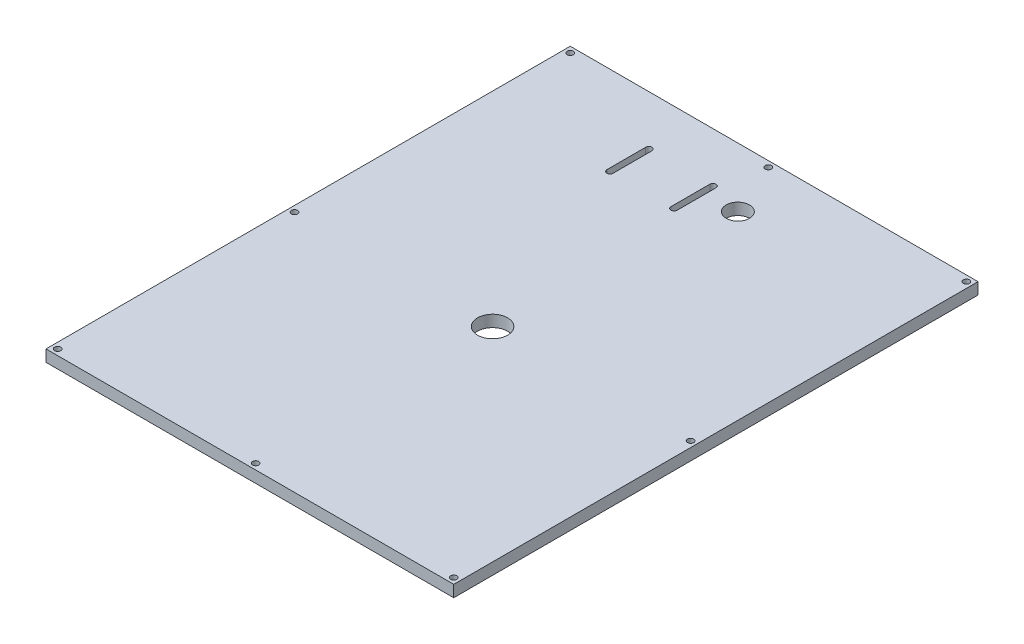
ISO-10303-21;
HEADER;
FILE_DESCRIPTION(('STEP AP214'),'2;1');
FILE_NAME('part.step','',(''),(''),'','','');
FILE_SCHEMA(('AUTOMOTIVE_DESIGN { 1 0 10303 214 1 1 1 1 }'));
ENDSEC;
DATA;
#1=APPLICATION_CONTEXT('core data for automotive mechanical design processes');
#2=APPLICATION_PROTOCOL_DEFINITION('international standard','automotive_design',2000,#1);
#3=PRODUCT_CONTEXT('',#1,'mechanical');
#4=PRODUCT('Part','Part','',(#3));
#5=PRODUCT_RELATED_PRODUCT_CATEGORY('part','',(#4));
#6=PRODUCT_DEFINITION_FORMATION('','',#4);
#7=PRODUCT_DEFINITION_CONTEXT('part definition',#1,'design');
#8=PRODUCT_DEFINITION('design','',#6,#7);
#9=PRODUCT_DEFINITION_SHAPE('','',#8);
#10=(LENGTH_UNIT() NAMED_UNIT(*) SI_UNIT(.MILLI.,.METRE.));
#11=(NAMED_UNIT(*) PLANE_ANGLE_UNIT() SI_UNIT($,.RADIAN.));
#12=(NAMED_UNIT(*) SI_UNIT($,.STERADIAN.) SOLID_ANGLE_UNIT());
#13=UNCERTAINTY_MEASURE_WITH_UNIT(LENGTH_MEASURE(1.E-05),#10,'distance_accuracy_value','');
#14=(GEOMETRIC_REPRESENTATION_CONTEXT(3) GLOBAL_UNCERTAINTY_ASSIGNED_CONTEXT((#13)) GLOBAL_UNIT_ASSIGNED_CONTEXT((#10,
#11,#12)) REPRESENTATION_CONTEXT('',''));
#15=CARTESIAN_POINT('',(0.,0.,0.));
#16=DIRECTION('',(0.,0.,1.));
#17=DIRECTION('',(1.,0.,0.));
#18=AXIS2_PLACEMENT_3D('',#15,#16,#17);
#19=CARTESIAN_POINT('',(0.,6.,0.));
#20=DIRECTION('',(0.,1.,0.));
#21=DIRECTION('',(0.,0.,1.));
#22=AXIS2_PLACEMENT_3D('',#19,#20,#21);
#23=PLANE('',#22);
#24=CARTESIAN_POINT('',(-38.919349673301,6.,-99.3873375567721));
#25=DIRECTION('',(0.,1.,0.));
#26=DIRECTION('',(0.,0.,1.));
#27=AXIS2_PLACEMENT_3D('',#24,#25,#26);
#28=CIRCLE('',#27,1.6);
#29=CARTESIAN_POINT('',(-40.519349673301,6.,-99.3873375567721));
#30=VERTEX_POINT('',#29);
#31=CARTESIAN_POINT('',(-37.319349673301,6.,-99.3873375567721));
#32=VERTEX_POINT('',#31);
#33=EDGE_CURVE('E142',#30,#32,#28,.T.);
#34=ORIENTED_EDGE('',*,*,#33,.F.);
#35=DIRECTION('',(0.,0.,1.));
#36=VECTOR('',#35,1.);
#37=CARTESIAN_POINT('',(-40.519349673301,6.,-119.387337556772));
#38=LINE('',#37,#36);
#39=CARTESIAN_POINT('',(-40.519349673301,6.,-119.387337556772));
#40=VERTEX_POINT('',#39);
#41=EDGE_CURVE('E224',#40,#30,#38,.T.);
#42=ORIENTED_EDGE('',*,*,#41,.F.);
#43=CARTESIAN_POINT('',(-38.919349673301,6.,-119.387337556772));
#44=DIRECTION('',(0.,1.,0.));
#45=DIRECTION('',(0.,0.,1.));
#46=AXIS2_PLACEMENT_3D('',#43,#44,#45);
#47=CIRCLE('',#46,1.6);
#48=CARTESIAN_POINT('',(-37.319349673301,6.,-119.387337556772));
#49=VERTEX_POINT('',#48);
#50=EDGE_CURVE('E49',#49,#40,#47,.T.);
#51=ORIENTED_EDGE('',*,*,#50,.F.);
#52=DIRECTION('',(0.,0.,-1.));
#53=VECTOR('',#52,1.);
#54=CARTESIAN_POINT('',(-37.319349673301,6.,-119.387337556772));
#55=LINE('',#54,#53);
#56=EDGE_CURVE('E227',#32,#49,#55,.T.);
#57=ORIENTED_EDGE('',*,*,#56,.F.);
#58=EDGE_LOOP('',(#34,#42,#51,#57));
#59=FACE_BOUND('',#58,.T.);
#60=CARTESIAN_POINT('',(-5.91934967330099,6.,-99.3873375567721));
#61=DIRECTION('',(0.,1.,0.));
#62=DIRECTION('',(0.,0.,1.));
#63=AXIS2_PLACEMENT_3D('',#60,#61,#62);
#64=CIRCLE('',#63,1.6);
#65=CARTESIAN_POINT('',(-7.51934967330099,6.,-99.3873375567721));
#66=VERTEX_POINT('',#65);
#67=CARTESIAN_POINT('',(-4.31934967330099,6.,-99.3873375567721));
#68=VERTEX_POINT('',#67);
#69=EDGE_CURVE('E154',#66,#68,#64,.T.);
#70=ORIENTED_EDGE('',*,*,#69,.F.);
#71=DIRECTION('',(0.,0.,1.));
#72=VECTOR('',#71,1.);
#73=CARTESIAN_POINT('',(-7.51934967330099,6.,-119.387337556772));
#74=LINE('',#73,#72);
#75=CARTESIAN_POINT('',(-7.51934967330099,6.,-119.387337556772));
#76=VERTEX_POINT('',#75);
#77=EDGE_CURVE('E234',#76,#66,#74,.T.);
#78=ORIENTED_EDGE('',*,*,#77,.F.);
#79=CARTESIAN_POINT('',(-5.91934967330099,6.,-119.387337556772));
#80=DIRECTION('',(0.,1.,0.));
#81=DIRECTION('',(0.,0.,-1.));
#82=AXIS2_PLACEMENT_3D('',#79,#80,#81);
#83=CIRCLE('',#82,1.6);
#84=CARTESIAN_POINT('',(-4.31934967330099,6.,-119.387337556772));
#85=VERTEX_POINT('',#84);
#86=EDGE_CURVE('E57',#85,#76,#83,.T.);
#87=ORIENTED_EDGE('',*,*,#86,.F.);
#88=DIRECTION('',(0.,0.,-1.));
#89=VECTOR('',#88,1.);
#90=CARTESIAN_POINT('',(-4.31934967330099,6.,-119.387337556772));
#91=LINE('',#90,#89);
#92=EDGE_CURVE('E236',#68,#85,#91,.T.);
#93=ORIENTED_EDGE('',*,*,#92,.F.);
#94=EDGE_LOOP('',(#70,#78,#87,#93));
#95=FACE_BOUND('',#94,.T.);
#96=CARTESIAN_POINT('',(0.,6.,0.));
#97=DIRECTION('',(0.,1.,0.));
#98=DIRECTION('',(0.,0.,1.));
#99=AXIS2_PLACEMENT_3D('',#96,#97,#98);
#100=CIRCLE('',#99,7.75);
#101=CARTESIAN_POINT('',(0.,6.,7.75));
#102=VERTEX_POINT('',#101);
#103=EDGE_CURVE('E167',#102,#102,#100,.T.);
#104=ORIENTED_EDGE('',*,*,#103,.F.);
#105=EDGE_LOOP('',(#104));
#106=FACE_BOUND('',#105,.T.);
#107=CARTESIAN_POINT('',(-102.,6.,122.));
#108=DIRECTION('',(0.,1.,0.));
#109=DIRECTION('',(0.,0.,1.));
#110=AXIS2_PLACEMENT_3D('',#107,#108,#109);
#111=CIRCLE('',#110,1.60000000000001);
#112=CARTESIAN_POINT('',(-102.,6.,123.6));
#113=VERTEX_POINT('',#112);
#114=EDGE_CURVE('E184',#113,#113,#111,.T.);
#115=ORIENTED_EDGE('',*,*,#114,.F.);
#116=EDGE_LOOP('',(#115));
#117=FACE_BOUND('',#116,.T.);
#118=CARTESIAN_POINT('',(102.,6.,122.));
#119=DIRECTION('',(0.,1.,0.));
#120=DIRECTION('',(0.,0.,1.));
#121=AXIS2_PLACEMENT_3D('',#118,#119,#120);
#122=CIRCLE('',#121,1.60000000000001);
#123=CARTESIAN_POINT('',(102.,6.,123.6));
#124=VERTEX_POINT('',#123);
#125=EDGE_CURVE('E187',#124,#124,#122,.T.);
#126=ORIENTED_EDGE('',*,*,#125,.F.);
#127=EDGE_LOOP('',(#126));
#128=FACE_BOUND('',#127,.T.);
#129=CARTESIAN_POINT('',(0.,6.,122.));
#130=DIRECTION('',(0.,1.,0.));
#131=DIRECTION('',(0.,0.,1.));
#132=AXIS2_PLACEMENT_3D('',#129,#130,#131);
#133=CIRCLE('',#132,1.6);
#134=CARTESIAN_POINT('',(0.,6.,123.6));
#135=VERTEX_POINT('',#134);
#136=EDGE_CURVE('E170',#135,#135,#133,.T.);
#137=ORIENTED_EDGE('',*,*,#136,.F.);
#138=EDGE_LOOP('',(#137));
#139=FACE_BOUND('',#138,.T.);
#140=CARTESIAN_POINT('',(102.,6.,0.));
#141=DIRECTION('',(0.,1.,0.));
#142=DIRECTION('',(0.,0.,1.));
#143=AXIS2_PLACEMENT_3D('',#140,#141,#142);
#144=CIRCLE('',#143,1.60000000000001);
#145=CARTESIAN_POINT('',(102.,6.,1.60000000000001));
#146=VERTEX_POINT('',#145);
#147=EDGE_CURVE('E181',#146,#146,#144,.T.);
#148=ORIENTED_EDGE('',*,*,#147,.F.);
#149=EDGE_LOOP('',(#148));
#150=FACE_BOUND('',#149,.T.);
#151=CARTESIAN_POINT('',(-102.,6.,0.));
#152=DIRECTION('',(0.,1.,0.));
#153=DIRECTION('',(0.,0.,1.));
#154=AXIS2_PLACEMENT_3D('',#151,#152,#153);
#155=CIRCLE('',#154,1.60000000000001);
#156=CARTESIAN_POINT('',(-102.,6.,1.60000000000001));
#157=VERTEX_POINT('',#156);
#158=EDGE_CURVE('E178',#157,#157,#155,.T.);
#159=ORIENTED_EDGE('',*,*,#158,.F.);
#160=EDGE_LOOP('',(#159));
#161=FACE_BOUND('',#160,.T.);
#162=CARTESIAN_POINT('',(102.,6.,-142.));
#163=DIRECTION('',(0.,1.,0.));
#164=DIRECTION('',(0.,0.,1.));
#165=AXIS2_PLACEMENT_3D('',#162,#163,#164);
#166=CIRCLE('',#165,1.6);
#167=CARTESIAN_POINT('',(102.,6.,-140.4));
#168=VERTEX_POINT('',#167);
#169=EDGE_CURVE('E175',#168,#168,#166,.T.);
#170=ORIENTED_EDGE('',*,*,#169,.F.);
#171=EDGE_LOOP('',(#170));
#172=FACE_BOUND('',#171,.T.);
#173=CARTESIAN_POINT('',(0.,6.,-142.));
#174=DIRECTION('',(0.,1.,0.));
#175=DIRECTION('',(0.,0.,1.));
#176=AXIS2_PLACEMENT_3D('',#173,#174,#175);
#177=CIRCLE('',#176,1.6);
#178=CARTESIAN_POINT('',(0.,6.,-140.4));
#179=VERTEX_POINT('',#178);
#180=EDGE_CURVE('E171',#179,#179,#177,.T.);
#181=ORIENTED_EDGE('',*,*,#180,.F.);
#182=EDGE_LOOP('',(#181));
#183=FACE_BOUND('',#182,.T.);
#184=CARTESIAN_POINT('',(-102.,6.,-142.));
#185=DIRECTION('',(0.,1.,0.));
#186=DIRECTION('',(0.,0.,1.));
#187=AXIS2_PLACEMENT_3D('',#184,#185,#186);
#188=CIRCLE('',#187,1.6);
#189=CARTESIAN_POINT('',(-102.,6.,-140.4));
#190=VERTEX_POINT('',#189);
#191=EDGE_CURVE('E174',#190,#190,#188,.T.);
#192=ORIENTED_EDGE('',*,*,#191,.F.);
#193=EDGE_LOOP('',(#192));
#194=FACE_BOUND('',#193,.T.);
#195=CARTESIAN_POINT('',(11.9274601671938,6.,-114.387337556772));
#196=DIRECTION('',(0.,1.,0.));
#197=DIRECTION('',(0.,0.,1.));
#198=AXIS2_PLACEMENT_3D('',#195,#196,#197);
#199=CIRCLE('',#198,6.00000000000001);
#200=CARTESIAN_POINT('',(11.9274601671938,6.,-108.387337556772));
#201=VERTEX_POINT('',#200);
#202=EDGE_CURVE('E211',#201,#201,#199,.T.);
#203=ORIENTED_EDGE('',*,*,#202,.F.);
#204=EDGE_LOOP('',(#203));
#205=FACE_BOUND('',#204,.T.);
#206=DIRECTION('',(1.,0.,0.));
#207=VECTOR('',#206,1.);
#208=CARTESIAN_POINT('',(-75.,6.,125.));
#209=LINE('',#208,#207);
#210=CARTESIAN_POINT('',(-105.,6.,125.));
#211=VERTEX_POINT('',#210);
#212=CARTESIAN_POINT('',(105.,6.,125.));
#213=VERTEX_POINT('',#212);
#214=EDGE_CURVE('E246',#211,#213,#209,.T.);
#215=ORIENTED_EDGE('',*,*,#214,.T.);
#216=DIRECTION('',(0.,0.,-1.));
#217=VECTOR('',#216,1.);
#218=CARTESIAN_POINT('',(105.,6.,-145.));
#219=LINE('',#218,#217);
#220=CARTESIAN_POINT('',(105.,6.,-145.));
#221=VERTEX_POINT('',#220);
#222=EDGE_CURVE('E200',#213,#221,#219,.T.);
#223=ORIENTED_EDGE('',*,*,#222,.T.);
#224=DIRECTION('',(-1.,0.,0.));
#225=VECTOR('',#224,1.);
#226=CARTESIAN_POINT('',(-75.,6.,-145.));
#227=LINE('',#226,#225);
#228=CARTESIAN_POINT('',(-105.,6.,-145.));
#229=VERTEX_POINT('',#228);
#230=EDGE_CURVE('E231',#221,#229,#227,.T.);
#231=ORIENTED_EDGE('',*,*,#230,.T.);
#232=DIRECTION('',(0.,0.,1.));
#233=VECTOR('',#232,1.);
#234=CARTESIAN_POINT('',(-105.,6.,-145.));
#235=LINE('',#234,#233);
#236=EDGE_CURVE('E198',#229,#211,#235,.T.);
#237=ORIENTED_EDGE('',*,*,#236,.T.);
#238=EDGE_LOOP('',(#215,#223,#231,#237));
#239=FACE_BOUND('',#238,.T.);
#240=ADVANCED_FACE('F32',(#59,#95,#106,#117,#128,#139,#150,#161,#172,#183,#194,#205,#239),#23,.T.);
#241=CARTESIAN_POINT('',(0.,0.,0.));
#242=DIRECTION('',(0.,1.,0.));
#243=DIRECTION('',(0.,0.,1.));
#244=AXIS2_PLACEMENT_3D('',#241,#242,#243);
#245=PLANE('',#244);
#246=CARTESIAN_POINT('',(0.,0.,0.));
#247=DIRECTION('',(0.,-1.,0.));
#248=DIRECTION('',(0.,0.,-1.));
#249=AXIS2_PLACEMENT_3D('',#246,#247,#248);
#250=CIRCLE('',#249,7.75);
#251=CARTESIAN_POINT('',(0.,0.,-7.75));
#252=VERTEX_POINT('',#251);
#253=EDGE_CURVE('E164',#252,#252,#250,.T.);
#254=ORIENTED_EDGE('',*,*,#253,.F.);
#255=EDGE_LOOP('',(#254));
#256=FACE_BOUND('',#255,.T.);
#257=CARTESIAN_POINT('',(-102.,0.,122.));
#258=DIRECTION('',(0.,1.,0.));
#259=DIRECTION('',(0.,0.,1.));
#260=AXIS2_PLACEMENT_3D('',#257,#258,#259);
#261=CIRCLE('',#260,1.60000000000001);
#262=CARTESIAN_POINT('',(-102.,0.,123.6));
#263=VERTEX_POINT('',#262);
#264=EDGE_CURVE('E36',#263,#263,#261,.T.);
#265=ORIENTED_EDGE('',*,*,#264,.T.);
#266=EDGE_LOOP('',(#265));
#267=FACE_BOUND('',#266,.T.);
#268=CARTESIAN_POINT('',(102.,0.,122.));
#269=DIRECTION('',(0.,1.,0.));
#270=DIRECTION('',(0.,0.,1.));
#271=AXIS2_PLACEMENT_3D('',#268,#269,#270);
#272=CIRCLE('',#271,1.60000000000001);
#273=CARTESIAN_POINT('',(102.,0.,123.6));
#274=VERTEX_POINT('',#273);
#275=EDGE_CURVE('E276',#274,#274,#272,.T.);
#276=ORIENTED_EDGE('',*,*,#275,.T.);
#277=EDGE_LOOP('',(#276));
#278=FACE_BOUND('',#277,.T.);
#279=CARTESIAN_POINT('',(0.,0.,122.));
#280=DIRECTION('',(0.,1.,0.));
#281=DIRECTION('',(0.,0.,1.));
#282=AXIS2_PLACEMENT_3D('',#279,#280,#281);
#283=CIRCLE('',#282,1.6);
#284=CARTESIAN_POINT('',(0.,0.,123.6));
#285=VERTEX_POINT('',#284);
#286=EDGE_CURVE('E274',#285,#285,#283,.T.);
#287=ORIENTED_EDGE('',*,*,#286,.T.);
#288=EDGE_LOOP('',(#287));
#289=FACE_BOUND('',#288,.T.);
#290=CARTESIAN_POINT('',(102.,0.,0.));
#291=DIRECTION('',(0.,1.,0.));
#292=DIRECTION('',(0.,0.,1.));
#293=AXIS2_PLACEMENT_3D('',#290,#291,#292);
#294=CIRCLE('',#293,1.60000000000001);
#295=CARTESIAN_POINT('',(102.,0.,1.60000000000001));
#296=VERTEX_POINT('',#295);
#297=EDGE_CURVE('E271',#296,#296,#294,.T.);
#298=ORIENTED_EDGE('',*,*,#297,.T.);
#299=EDGE_LOOP('',(#298));
#300=FACE_BOUND('',#299,.T.);
#301=CARTESIAN_POINT('',(-102.,0.,0.));
#302=DIRECTION('',(0.,1.,0.));
#303=DIRECTION('',(0.,0.,1.));
#304=AXIS2_PLACEMENT_3D('',#301,#302,#303);
#305=CIRCLE('',#304,1.60000000000001);
#306=CARTESIAN_POINT('',(-102.,0.,1.60000000000001));
#307=VERTEX_POINT('',#306);
#308=EDGE_CURVE('E268',#307,#307,#305,.T.);
#309=ORIENTED_EDGE('',*,*,#308,.T.);
#310=EDGE_LOOP('',(#309));
#311=FACE_BOUND('',#310,.T.);
#312=CARTESIAN_POINT('',(102.,0.,-142.));
#313=DIRECTION('',(0.,1.,0.));
#314=DIRECTION('',(0.,0.,1.));
#315=AXIS2_PLACEMENT_3D('',#312,#313,#314);
#316=CIRCLE('',#315,1.6);
#317=CARTESIAN_POINT('',(102.,0.,-140.4));
#318=VERTEX_POINT('',#317);
#319=EDGE_CURVE('E265',#318,#318,#316,.T.);
#320=ORIENTED_EDGE('',*,*,#319,.T.);
#321=EDGE_LOOP('',(#320));
#322=FACE_BOUND('',#321,.T.);
#323=CARTESIAN_POINT('',(0.,0.,-142.));
#324=DIRECTION('',(0.,1.,0.));
#325=DIRECTION('',(0.,0.,1.));
#326=AXIS2_PLACEMENT_3D('',#323,#324,#325);
#327=CIRCLE('',#326,1.6);
#328=CARTESIAN_POINT('',(0.,0.,-140.4));
#329=VERTEX_POINT('',#328);
#330=EDGE_CURVE('E262',#329,#329,#327,.T.);
#331=ORIENTED_EDGE('',*,*,#330,.T.);
#332=EDGE_LOOP('',(#331));
#333=FACE_BOUND('',#332,.T.);
#334=CARTESIAN_POINT('',(-102.,0.,-142.));
#335=DIRECTION('',(0.,1.,0.));
#336=DIRECTION('',(0.,0.,1.));
#337=AXIS2_PLACEMENT_3D('',#334,#335,#336);
#338=CIRCLE('',#337,1.6);
#339=CARTESIAN_POINT('',(-102.,0.,-140.4));
#340=VERTEX_POINT('',#339);
#341=EDGE_CURVE('E194',#340,#340,#338,.T.);
#342=ORIENTED_EDGE('',*,*,#341,.T.);
#343=EDGE_LOOP('',(#342));
#344=FACE_BOUND('',#343,.T.);
#345=CARTESIAN_POINT('',(11.9274601671938,0.,-114.387337556772));
#346=DIRECTION('',(0.,1.,0.));
#347=DIRECTION('',(0.,0.,1.));
#348=AXIS2_PLACEMENT_3D('',#345,#346,#347);
#349=CIRCLE('',#348,6.00000000000001);
#350=CARTESIAN_POINT('',(11.9274601671938,0.,-108.387337556772));
#351=VERTEX_POINT('',#350);
#352=EDGE_CURVE('E222',#351,#351,#349,.T.);
#353=ORIENTED_EDGE('',*,*,#352,.T.);
#354=EDGE_LOOP('',(#353));
#355=FACE_BOUND('',#354,.T.);
#356=DIRECTION('',(0.,0.,1.));
#357=VECTOR('',#356,1.);
#358=CARTESIAN_POINT('',(-40.519349673301,0.,0.));
#359=LINE('',#358,#357);
#360=CARTESIAN_POINT('',(-40.519349673301,0.,-119.387337556772));
#361=VERTEX_POINT('',#360);
#362=CARTESIAN_POINT('',(-40.519349673301,0.,-99.3873375567721));
#363=VERTEX_POINT('',#362);
#364=EDGE_CURVE('E133',#361,#363,#359,.T.);
#365=ORIENTED_EDGE('',*,*,#364,.T.);
#366=CARTESIAN_POINT('',(-38.919349673301,0.,-99.3873375567721));
#367=DIRECTION('',(0.,-1.,0.));
#368=DIRECTION('',(0.,0.,-1.));
#369=AXIS2_PLACEMENT_3D('',#366,#367,#368);
#370=CIRCLE('',#369,1.6);
#371=CARTESIAN_POINT('',(-37.319349673301,0.,-99.3873375567721));
#372=VERTEX_POINT('',#371);
#373=EDGE_CURVE('E140',#372,#363,#370,.T.);
#374=ORIENTED_EDGE('',*,*,#373,.F.);
#375=DIRECTION('',(0.,0.,-1.));
#376=VECTOR('',#375,1.);
#377=CARTESIAN_POINT('',(-37.319349673301,0.,0.));
#378=LINE('',#377,#376);
#379=CARTESIAN_POINT('',(-37.319349673301,0.,-119.387337556772));
#380=VERTEX_POINT('',#379);
#381=EDGE_CURVE('E41',#372,#380,#378,.T.);
#382=ORIENTED_EDGE('',*,*,#381,.T.);
#383=CARTESIAN_POINT('',(-38.919349673301,0.,-119.387337556772));
#384=DIRECTION('',(0.,1.,0.));
#385=DIRECTION('',(0.,0.,1.));
#386=AXIS2_PLACEMENT_3D('',#383,#384,#385);
#387=CIRCLE('',#386,1.6);
#388=EDGE_CURVE('E11',#380,#361,#387,.T.);
#389=ORIENTED_EDGE('',*,*,#388,.T.);
#390=EDGE_LOOP('',(#365,#374,#382,#389));
#391=FACE_BOUND('',#390,.T.);
#392=DIRECTION('',(0.,0.,1.));
#393=VECTOR('',#392,1.);
#394=CARTESIAN_POINT('',(-7.51934967330099,0.,0.));
#395=LINE('',#394,#393);
#396=CARTESIAN_POINT('',(-7.51934967330099,0.,-119.387337556772));
#397=VERTEX_POINT('',#396);
#398=CARTESIAN_POINT('',(-7.51934967330099,0.,-99.3873375567721));
#399=VERTEX_POINT('',#398);
#400=EDGE_CURVE('E248',#397,#399,#395,.T.);
#401=ORIENTED_EDGE('',*,*,#400,.T.);
#402=CARTESIAN_POINT('',(-5.91934967330099,0.,-99.3873375567721));
#403=DIRECTION('',(0.,-1.,0.));
#404=DIRECTION('',(0.,0.,-1.));
#405=AXIS2_PLACEMENT_3D('',#402,#403,#404);
#406=CIRCLE('',#405,1.6);
#407=CARTESIAN_POINT('',(-4.31934967330099,0.,-99.3873375567721));
#408=VERTEX_POINT('',#407);
#409=EDGE_CURVE('E156',#408,#399,#406,.T.);
#410=ORIENTED_EDGE('',*,*,#409,.F.);
#411=DIRECTION('',(0.,0.,-1.));
#412=VECTOR('',#411,1.);
#413=CARTESIAN_POINT('',(-4.31934967330097,0.,0.));
#414=LINE('',#413,#412);
#415=CARTESIAN_POINT('',(-4.31934967330099,0.,-119.387337556772));
#416=VERTEX_POINT('',#415);
#417=EDGE_CURVE('E251',#408,#416,#414,.T.);
#418=ORIENTED_EDGE('',*,*,#417,.T.);
#419=CARTESIAN_POINT('',(-5.91934967330099,0.,-119.387337556772));
#420=DIRECTION('',(0.,1.,0.));
#421=DIRECTION('',(0.,0.,1.));
#422=AXIS2_PLACEMENT_3D('',#419,#420,#421);
#423=CIRCLE('',#422,1.6);
#424=EDGE_CURVE('E254',#416,#397,#423,.T.);
#425=ORIENTED_EDGE('',*,*,#424,.T.);
#426=EDGE_LOOP('',(#401,#410,#418,#425));
#427=FACE_BOUND('',#426,.T.);
#428=DIRECTION('',(1.,0.,0.));
#429=VECTOR('',#428,1.);
#430=CARTESIAN_POINT('',(-75.,0.,-145.));
#431=LINE('',#430,#429);
#432=CARTESIAN_POINT('',(-105.,0.,-145.));
#433=VERTEX_POINT('',#432);
#434=CARTESIAN_POINT('',(105.,0.,-145.));
#435=VERTEX_POINT('',#434);
#436=EDGE_CURVE('E242',#433,#435,#431,.T.);
#437=ORIENTED_EDGE('',*,*,#436,.T.);
#438=DIRECTION('',(0.,0.,1.));
#439=VECTOR('',#438,1.);
#440=CARTESIAN_POINT('',(105.,0.,-145.));
#441=LINE('',#440,#439);
#442=CARTESIAN_POINT('',(105.,0.,125.));
#443=VERTEX_POINT('',#442);
#444=EDGE_CURVE('E195',#435,#443,#441,.T.);
#445=ORIENTED_EDGE('',*,*,#444,.T.);
#446=DIRECTION('',(1.,0.,0.));
#447=VECTOR('',#446,1.);
#448=CARTESIAN_POINT('',(-75.,0.,125.));
#449=LINE('',#448,#447);
#450=CARTESIAN_POINT('',(-105.,0.,125.));
#451=VERTEX_POINT('',#450);
#452=EDGE_CURVE('E244',#451,#443,#449,.T.);
#453=ORIENTED_EDGE('',*,*,#452,.F.);
#454=DIRECTION('',(0.,0.,-1.));
#455=VECTOR('',#454,1.);
#456=CARTESIAN_POINT('',(-105.,0.,-145.));
#457=LINE('',#456,#455);
#458=EDGE_CURVE('E208',#451,#433,#457,.T.);
#459=ORIENTED_EDGE('',*,*,#458,.T.);
#460=EDGE_LOOP('',(#437,#445,#453,#459));
#461=FACE_BOUND('',#460,.T.);
#462=ADVANCED_FACE('F145',(#256,#267,#278,#289,#300,#311,#322,#333,#344,#355,#391,#427,#461),
#245,.F.);
#463=CARTESIAN_POINT('',(-75.,6.,125.));
#464=DIRECTION('',(0.,0.,-1.));
#465=DIRECTION('',(-1.,0.,0.));
#466=AXIS2_PLACEMENT_3D('',#463,#464,#465);
#467=PLANE('',#466);
#468=ORIENTED_EDGE('',*,*,#452,.T.);
#469=DIRECTION('',(0.,1.,0.));
#470=VECTOR('',#469,1.);
#471=CARTESIAN_POINT('',(105.,-271.661554144123,125.));
#472=LINE('',#471,#470);
#473=EDGE_CURVE('E203',#443,#213,#472,.T.);
#474=ORIENTED_EDGE('',*,*,#473,.T.);
#475=ORIENTED_EDGE('',*,*,#214,.F.);
#476=DIRECTION('',(0.,1.,0.));
#477=VECTOR('',#476,1.);
#478=CARTESIAN_POINT('',(-105.,-271.661554144123,125.));
#479=LINE('',#478,#477);
#480=EDGE_CURVE('E212',#451,#211,#479,.T.);
#481=ORIENTED_EDGE('',*,*,#480,.F.);
#482=EDGE_LOOP('',(#468,#474,#475,#481));
#483=FACE_BOUND('',#482,.T.);
#484=ADVANCED_FACE('F34',(#483),#467,.F.);
#485=CARTESIAN_POINT('',(-75.,-151.327459504216,-145.));
#486=DIRECTION('',(0.,0.,-1.));
#487=DIRECTION('',(-1.,0.,0.));
#488=AXIS2_PLACEMENT_3D('',#485,#486,#487);
#489=PLANE('',#488);
#490=ORIENTED_EDGE('',*,*,#436,.F.);
#491=DIRECTION('',(0.,1.,0.));
#492=VECTOR('',#491,1.);
#493=CARTESIAN_POINT('',(-105.,-271.661554144123,-145.));
#494=LINE('',#493,#492);
#495=EDGE_CURVE('E215',#433,#229,#494,.T.);
#496=ORIENTED_EDGE('',*,*,#495,.T.);
#497=ORIENTED_EDGE('',*,*,#230,.F.);
#498=DIRECTION('',(0.,1.,0.));
#499=VECTOR('',#498,1.);
#500=CARTESIAN_POINT('',(105.,-271.661554144123,-145.));
#501=LINE('',#500,#499);
#502=EDGE_CURVE('E199',#435,#221,#501,.T.);
#503=ORIENTED_EDGE('',*,*,#502,.F.);
#504=EDGE_LOOP('',(#490,#496,#497,#503));
#505=FACE_BOUND('',#504,.T.);
#506=ADVANCED_FACE('F309',(#505),#489,.T.);
#507=CARTESIAN_POINT('',(-5.91934967330099,-16.,-119.387337556772));
#508=DIRECTION('',(0.,1.,0.));
#509=DIRECTION('',(0.,0.,1.));
#510=AXIS2_PLACEMENT_3D('',#507,#508,#509);
#511=CYLINDRICAL_SURFACE('',#510,1.6);
#512=DIRECTION('',(0.,1.,0.));
#513=VECTOR('',#512,1.);
#514=CARTESIAN_POINT('',(-4.31934967330099,-16.,-119.387337556772));
#515=LINE('',#514,#513);
#516=EDGE_CURVE('E225',#416,#85,#515,.T.);
#517=ORIENTED_EDGE('',*,*,#516,.T.);
#518=ORIENTED_EDGE('',*,*,#86,.T.);
#519=DIRECTION('',(0.,1.,0.));
#520=VECTOR('',#519,1.);
#521=CARTESIAN_POINT('',(-7.51934967330099,-16.,-119.387337556772));
#522=LINE('',#521,#520);
#523=EDGE_CURVE('E239',#397,#76,#522,.T.);
#524=ORIENTED_EDGE('',*,*,#523,.F.);
#525=ORIENTED_EDGE('',*,*,#424,.F.);
#526=EDGE_LOOP('',(#517,#518,#524,#525));
#527=FACE_BOUND('',#526,.T.);
#528=ADVANCED_FACE('F312',(#527),#511,.F.);
#529=CARTESIAN_POINT('',(-4.31934967330099,-16.,-119.387337556772));
#530=DIRECTION('',(1.,0.,0.));
#531=DIRECTION('',(0.,0.,-1.));
#532=AXIS2_PLACEMENT_3D('',#529,#530,#531);
#533=PLANE('',#532);
#534=ORIENTED_EDGE('',*,*,#417,.F.);
#535=DIRECTION('',(0.,-1.,0.));
#536=VECTOR('',#535,1.);
#537=CARTESIAN_POINT('',(-4.31934967330099,10.,-99.3873375567721));
#538=LINE('',#537,#536);
#539=EDGE_CURVE('E151',#68,#408,#538,.T.);
#540=ORIENTED_EDGE('',*,*,#539,.F.);
#541=ORIENTED_EDGE('',*,*,#92,.T.);
#542=ORIENTED_EDGE('',*,*,#516,.F.);
#543=EDGE_LOOP('',(#534,#540,#541,#542));
#544=FACE_BOUND('',#543,.T.);
#545=ADVANCED_FACE('F316',(#544),#533,.F.);
#546=CARTESIAN_POINT('',(-7.51934967330099,-16.,-119.387337556772));
#547=DIRECTION('',(-1.,0.,0.));
#548=DIRECTION('',(0.,0.,1.));
#549=AXIS2_PLACEMENT_3D('',#546,#547,#548);
#550=PLANE('',#549);
#551=ORIENTED_EDGE('',*,*,#523,.T.);
#552=ORIENTED_EDGE('',*,*,#77,.T.);
#553=DIRECTION('',(0.,-1.,0.));
#554=VECTOR('',#553,1.);
#555=CARTESIAN_POINT('',(-7.51934967330099,10.,-99.3873375567721));
#556=LINE('',#555,#554);
#557=EDGE_CURVE('E148',#66,#399,#556,.T.);
#558=ORIENTED_EDGE('',*,*,#557,.T.);
#559=ORIENTED_EDGE('',*,*,#400,.F.);
#560=EDGE_LOOP('',(#551,#552,#558,#559));
#561=FACE_BOUND('',#560,.T.);
#562=ADVANCED_FACE('F317',(#561),#550,.F.);
#563=CARTESIAN_POINT('',(-38.919349673301,-16.,-119.387337556772));
#564=DIRECTION('',(0.,1.,0.));
#565=DIRECTION('',(0.,0.,1.));
#566=AXIS2_PLACEMENT_3D('',#563,#564,#565);
#567=CYLINDRICAL_SURFACE('',#566,1.6);
#568=DIRECTION('',(0.,1.,0.));
#569=VECTOR('',#568,1.);
#570=CARTESIAN_POINT('',(-37.319349673301,-16.,-119.387337556772));
#571=LINE('',#570,#569);
#572=EDGE_CURVE('E130',#380,#49,#571,.T.);
#573=ORIENTED_EDGE('',*,*,#572,.T.);
#574=ORIENTED_EDGE('',*,*,#50,.T.);
#575=DIRECTION('',(0.,1.,0.));
#576=VECTOR('',#575,1.);
#577=CARTESIAN_POINT('',(-40.519349673301,-16.,-119.387337556772));
#578=LINE('',#577,#576);
#579=EDGE_CURVE('E229',#361,#40,#578,.T.);
#580=ORIENTED_EDGE('',*,*,#579,.F.);
#581=ORIENTED_EDGE('',*,*,#388,.F.);
#582=EDGE_LOOP('',(#573,#574,#580,#581));
#583=FACE_BOUND('',#582,.T.);
#584=ADVANCED_FACE('F320',(#583),#567,.F.);
#585=CARTESIAN_POINT('',(-37.319349673301,-16.,-119.387337556772));
#586=DIRECTION('',(1.,0.,0.));
#587=DIRECTION('',(0.,0.,-1.));
#588=AXIS2_PLACEMENT_3D('',#585,#586,#587);
#589=PLANE('',#588);
#590=ORIENTED_EDGE('',*,*,#381,.F.);
#591=DIRECTION('',(0.,-1.,0.));
#592=VECTOR('',#591,1.);
#593=CARTESIAN_POINT('',(-37.319349673301,10.,-99.3873375567721));
#594=LINE('',#593,#592);
#595=EDGE_CURVE('E129',#32,#372,#594,.T.);
#596=ORIENTED_EDGE('',*,*,#595,.F.);
#597=ORIENTED_EDGE('',*,*,#56,.T.);
#598=ORIENTED_EDGE('',*,*,#572,.F.);
#599=EDGE_LOOP('',(#590,#596,#597,#598));
#600=FACE_BOUND('',#599,.T.);
#601=ADVANCED_FACE('F127',(#600),#589,.F.);
#602=CARTESIAN_POINT('',(-40.519349673301,-16.,-119.387337556772));
#603=DIRECTION('',(-1.,0.,0.));
#604=DIRECTION('',(0.,0.,1.));
#605=AXIS2_PLACEMENT_3D('',#602,#603,#604);
#606=PLANE('',#605);
#607=ORIENTED_EDGE('',*,*,#579,.T.);
#608=ORIENTED_EDGE('',*,*,#41,.T.);
#609=DIRECTION('',(0.,-1.,0.));
#610=VECTOR('',#609,1.);
#611=CARTESIAN_POINT('',(-40.519349673301,10.,-99.3873375567721));
#612=LINE('',#611,#610);
#613=EDGE_CURVE('E143',#30,#363,#612,.T.);
#614=ORIENTED_EDGE('',*,*,#613,.T.);
#615=ORIENTED_EDGE('',*,*,#364,.F.);
#616=EDGE_LOOP('',(#607,#608,#614,#615));
#617=FACE_BOUND('',#616,.T.);
#618=ADVANCED_FACE('F327',(#617),#606,.F.);
#619=CARTESIAN_POINT('',(11.9274601671938,-10.,-114.387337556772));
#620=DIRECTION('',(0.,1.,0.));
#621=DIRECTION('',(0.,0.,1.));
#622=AXIS2_PLACEMENT_3D('',#619,#620,#621);
#623=CYLINDRICAL_SURFACE('',#622,6.00000000000001);
#624=ORIENTED_EDGE('',*,*,#202,.T.);
#625=EDGE_LOOP('',(#624));
#626=FACE_BOUND('',#625,.T.);
#627=ORIENTED_EDGE('',*,*,#352,.F.);
#628=EDGE_LOOP('',(#627));
#629=FACE_BOUND('',#628,.T.);
#630=ADVANCED_FACE('F330',(#626,#629),#623,.F.);
#631=CARTESIAN_POINT('',(-105.,-271.661554144123,-145.));
#632=DIRECTION('',(-1.,0.,0.));
#633=DIRECTION('',(0.,0.,1.));
#634=AXIS2_PLACEMENT_3D('',#631,#632,#633);
#635=PLANE('',#634);
#636=ORIENTED_EDGE('',*,*,#458,.F.);
#637=ORIENTED_EDGE('',*,*,#480,.T.);
#638=ORIENTED_EDGE('',*,*,#236,.F.);
#639=ORIENTED_EDGE('',*,*,#495,.F.);
#640=EDGE_LOOP('',(#636,#637,#638,#639));
#641=FACE_BOUND('',#640,.T.);
#642=ADVANCED_FACE('F336',(#641),#635,.T.);
#643=CARTESIAN_POINT('',(105.,-271.661554144123,-145.));
#644=DIRECTION('',(1.,0.,0.));
#645=DIRECTION('',(0.,0.,-1.));
#646=AXIS2_PLACEMENT_3D('',#643,#644,#645);
#647=PLANE('',#646);
#648=ORIENTED_EDGE('',*,*,#444,.F.);
#649=ORIENTED_EDGE('',*,*,#502,.T.);
#650=ORIENTED_EDGE('',*,*,#222,.F.);
#651=ORIENTED_EDGE('',*,*,#473,.F.);
#652=EDGE_LOOP('',(#648,#649,#650,#651));
#653=FACE_BOUND('',#652,.T.);
#654=ADVANCED_FACE('F340',(#653),#647,.T.);
#655=CARTESIAN_POINT('',(-102.,-4.,-142.));
#656=DIRECTION('',(0.,1.,0.));
#657=DIRECTION('',(0.,0.,1.));
#658=AXIS2_PLACEMENT_3D('',#655,#656,#657);
#659=CYLINDRICAL_SURFACE('',#658,1.6);
#660=ORIENTED_EDGE('',*,*,#191,.T.);
#661=EDGE_LOOP('',(#660));
#662=FACE_BOUND('',#661,.T.);
#663=ORIENTED_EDGE('',*,*,#341,.F.);
#664=EDGE_LOOP('',(#663));
#665=FACE_BOUND('',#664,.T.);
#666=ADVANCED_FACE('F344',(#662,#665),#659,.F.);
#667=CARTESIAN_POINT('',(0.,-4.,-142.));
#668=DIRECTION('',(0.,1.,0.));
#669=DIRECTION('',(0.,0.,1.));
#670=AXIS2_PLACEMENT_3D('',#667,#668,#669);
#671=CYLINDRICAL_SURFACE('',#670,1.6);
#672=ORIENTED_EDGE('',*,*,#180,.T.);
#673=EDGE_LOOP('',(#672));
#674=FACE_BOUND('',#673,.T.);
#675=ORIENTED_EDGE('',*,*,#330,.F.);
#676=EDGE_LOOP('',(#675));
#677=FACE_BOUND('',#676,.T.);
#678=ADVANCED_FACE('F347',(#674,#677),#671,.F.);
#679=CARTESIAN_POINT('',(102.,-4.,-142.));
#680=DIRECTION('',(0.,1.,0.));
#681=DIRECTION('',(0.,0.,1.));
#682=AXIS2_PLACEMENT_3D('',#679,#680,#681);
#683=CYLINDRICAL_SURFACE('',#682,1.6);
#684=ORIENTED_EDGE('',*,*,#169,.T.);
#685=EDGE_LOOP('',(#684));
#686=FACE_BOUND('',#685,.T.);
#687=ORIENTED_EDGE('',*,*,#319,.F.);
#688=EDGE_LOOP('',(#687));
#689=FACE_BOUND('',#688,.T.);
#690=ADVANCED_FACE('F352',(#686,#689),#683,.F.);
#691=CARTESIAN_POINT('',(-102.,-4.,0.));
#692=DIRECTION('',(0.,1.,0.));
#693=DIRECTION('',(0.,0.,1.));
#694=AXIS2_PLACEMENT_3D('',#691,#692,#693);
#695=CYLINDRICAL_SURFACE('',#694,1.60000000000001);
#696=ORIENTED_EDGE('',*,*,#158,.T.);
#697=EDGE_LOOP('',(#696));
#698=FACE_BOUND('',#697,.T.);
#699=ORIENTED_EDGE('',*,*,#308,.F.);
#700=EDGE_LOOP('',(#699));
#701=FACE_BOUND('',#700,.T.);
#702=ADVANCED_FACE('F441',(#698,#701),#695,.F.);
#703=CARTESIAN_POINT('',(102.,-4.,0.));
#704=DIRECTION('',(0.,1.,0.));
#705=DIRECTION('',(0.,0.,1.));
#706=AXIS2_PLACEMENT_3D('',#703,#704,#705);
#707=CYLINDRICAL_SURFACE('',#706,1.60000000000001);
#708=ORIENTED_EDGE('',*,*,#147,.T.);
#709=EDGE_LOOP('',(#708));
#710=FACE_BOUND('',#709,.T.);
#711=ORIENTED_EDGE('',*,*,#297,.F.);
#712=EDGE_LOOP('',(#711));
#713=FACE_BOUND('',#712,.T.);
#714=ADVANCED_FACE('F451',(#710,#713),#707,.F.);
#715=CARTESIAN_POINT('',(0.,-4.,122.));
#716=DIRECTION('',(0.,1.,0.));
#717=DIRECTION('',(0.,0.,1.));
#718=AXIS2_PLACEMENT_3D('',#715,#716,#717);
#719=CYLINDRICAL_SURFACE('',#718,1.6);
#720=ORIENTED_EDGE('',*,*,#136,.T.);
#721=EDGE_LOOP('',(#720));
#722=FACE_BOUND('',#721,.T.);
#723=ORIENTED_EDGE('',*,*,#286,.F.);
#724=EDGE_LOOP('',(#723));
#725=FACE_BOUND('',#724,.T.);
#726=ADVANCED_FACE('F296',(#722,#725),#719,.F.);
#727=CARTESIAN_POINT('',(102.,-4.,122.));
#728=DIRECTION('',(0.,1.,0.));
#729=DIRECTION('',(0.,0.,1.));
#730=AXIS2_PLACEMENT_3D('',#727,#728,#729);
#731=CYLINDRICAL_SURFACE('',#730,1.60000000000001);
#732=ORIENTED_EDGE('',*,*,#125,.T.);
#733=EDGE_LOOP('',(#732));
#734=FACE_BOUND('',#733,.T.);
#735=ORIENTED_EDGE('',*,*,#275,.F.);
#736=EDGE_LOOP('',(#735));
#737=FACE_BOUND('',#736,.T.);
#738=ADVANCED_FACE('F287',(#734,#737),#731,.F.);
#739=CARTESIAN_POINT('',(-102.,-4.,122.));
#740=DIRECTION('',(0.,1.,0.));
#741=DIRECTION('',(0.,0.,1.));
#742=AXIS2_PLACEMENT_3D('',#739,#740,#741);
#743=CYLINDRICAL_SURFACE('',#742,1.60000000000001);
#744=ORIENTED_EDGE('',*,*,#114,.T.);
#745=EDGE_LOOP('',(#744));
#746=FACE_BOUND('',#745,.T.);
#747=ORIENTED_EDGE('',*,*,#264,.F.);
#748=EDGE_LOOP('',(#747));
#749=FACE_BOUND('',#748,.T.);
#750=ADVANCED_FACE('F284',(#746,#749),#743,.F.);
#751=CARTESIAN_POINT('',(0.,10.,0.));
#752=DIRECTION('',(0.,-1.,0.));
#753=DIRECTION('',(0.,0.,-1.));
#754=AXIS2_PLACEMENT_3D('',#751,#752,#753);
#755=CYLINDRICAL_SURFACE('',#754,7.75);
#756=ORIENTED_EDGE('',*,*,#103,.T.);
#757=EDGE_LOOP('',(#756));
#758=FACE_BOUND('',#757,.T.);
#759=ORIENTED_EDGE('',*,*,#253,.T.);
#760=EDGE_LOOP('',(#759));
#761=FACE_BOUND('',#760,.T.);
#762=ADVANCED_FACE('F286',(#758,#761),#755,.F.);
#763=CARTESIAN_POINT('',(-38.919349673301,10.,-99.3873375567721));
#764=DIRECTION('',(0.,-1.,0.));
#765=DIRECTION('',(0.,0.,-1.));
#766=AXIS2_PLACEMENT_3D('',#763,#764,#765);
#767=CYLINDRICAL_SURFACE('',#766,1.6);
#768=ORIENTED_EDGE('',*,*,#33,.T.);
#769=ORIENTED_EDGE('',*,*,#595,.T.);
#770=ORIENTED_EDGE('',*,*,#373,.T.);
#771=ORIENTED_EDGE('',*,*,#613,.F.);
#772=EDGE_LOOP('',(#768,#769,#770,#771));
#773=FACE_BOUND('',#772,.T.);
#774=ADVANCED_FACE('F138',(#773),#767,.F.);
#775=CARTESIAN_POINT('',(-5.91934967330099,10.,-99.3873375567721));
#776=DIRECTION('',(0.,-1.,0.));
#777=DIRECTION('',(0.,0.,-1.));
#778=AXIS2_PLACEMENT_3D('',#775,#776,#777);
#779=CYLINDRICAL_SURFACE('',#778,1.6);
#780=ORIENTED_EDGE('',*,*,#69,.T.);
#781=ORIENTED_EDGE('',*,*,#539,.T.);
#782=ORIENTED_EDGE('',*,*,#409,.T.);
#783=ORIENTED_EDGE('',*,*,#557,.F.);
#784=EDGE_LOOP('',(#780,#781,#782,#783));
#785=FACE_BOUND('',#784,.T.);
#786=ADVANCED_FACE('F570',(#785),#779,.F.);
#787=CLOSED_SHELL('',(#240,#462,#484,#506,#528,#545,#562,#584,#601,#618,#630,#642,#654,#666,
#678,#690,#702,#714,#726,#738,#750,#762,#774,#786));
#788=MANIFOLD_SOLID_BREP('B2',#787);
#789=ADVANCED_BREP_SHAPE_REPRESENTATION('',(#18,#788),#14);
#790=SHAPE_DEFINITION_REPRESENTATION(#9,#789);
ENDSEC;
END-ISO-10303-21;
